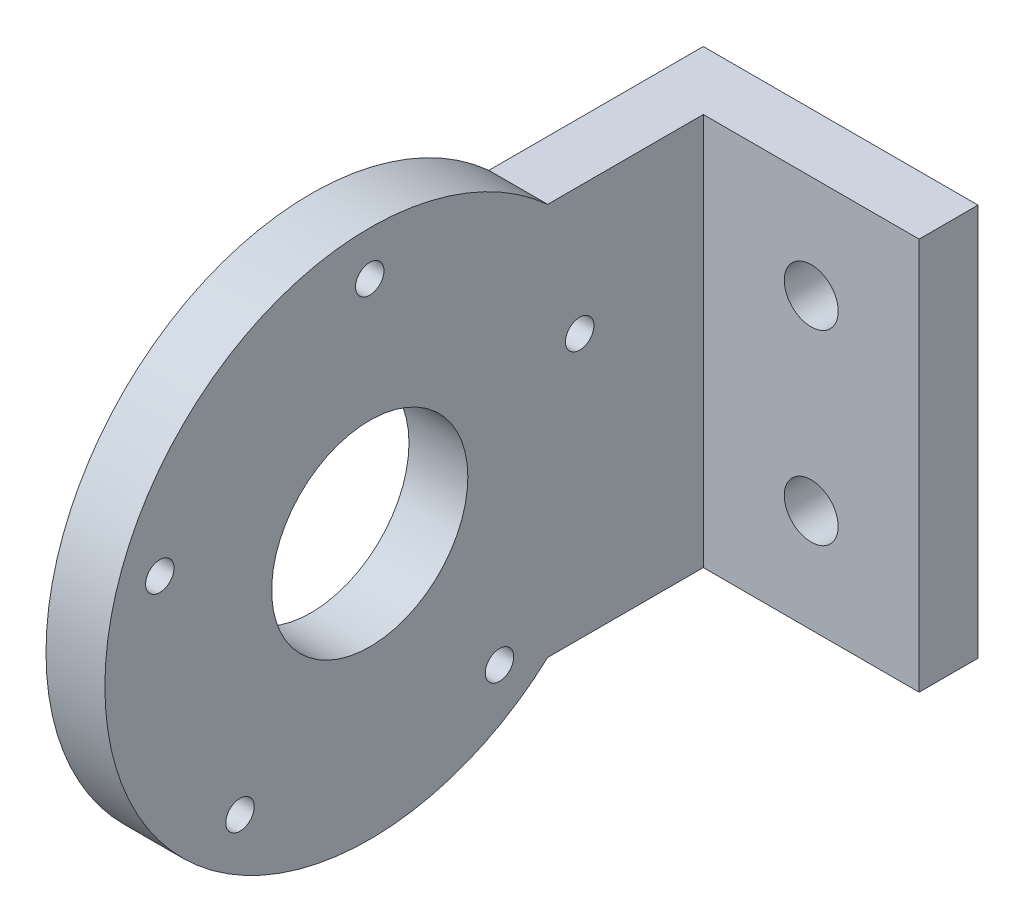
ISO-10303-21;
HEADER;
FILE_DESCRIPTION(('STEP AP214'),'2;1');
FILE_NAME('part.step','',(''),(''),'','','');
FILE_SCHEMA(('AUTOMOTIVE_DESIGN { 1 0 10303 214 1 1 1 1 }'));
ENDSEC;
DATA;
#1=APPLICATION_CONTEXT('core data for automotive mechanical design processes');
#2=APPLICATION_PROTOCOL_DEFINITION('international standard','automotive_design',2000,#1);
#3=PRODUCT_CONTEXT('',#1,'mechanical');
#4=PRODUCT('Part','Part','',(#3));
#5=PRODUCT_RELATED_PRODUCT_CATEGORY('part','',(#4));
#6=PRODUCT_DEFINITION_FORMATION('','',#4);
#7=PRODUCT_DEFINITION_CONTEXT('part definition',#1,'design');
#8=PRODUCT_DEFINITION('design','',#6,#7);
#9=PRODUCT_DEFINITION_SHAPE('','',#8);
#10=(LENGTH_UNIT() NAMED_UNIT(*) SI_UNIT(.MILLI.,.METRE.));
#11=(NAMED_UNIT(*) PLANE_ANGLE_UNIT() SI_UNIT($,.RADIAN.));
#12=(NAMED_UNIT(*) SI_UNIT($,.STERADIAN.) SOLID_ANGLE_UNIT());
#13=UNCERTAINTY_MEASURE_WITH_UNIT(LENGTH_MEASURE(1.E-05),#10,'distance_accuracy_value','');
#14=(GEOMETRIC_REPRESENTATION_CONTEXT(3) GLOBAL_UNCERTAINTY_ASSIGNED_CONTEXT((#13)) GLOBAL_UNIT_ASSIGNED_CONTEXT((#10,
#11,#12)) REPRESENTATION_CONTEXT('',''));
#15=CARTESIAN_POINT('',(0.,0.,0.));
#16=DIRECTION('',(0.,0.,1.));
#17=DIRECTION('',(1.,0.,0.));
#18=AXIS2_PLACEMENT_3D('',#15,#16,#17);
#19=CARTESIAN_POINT('',(227.,300.,300.));
#20=DIRECTION('',(-1.,0.,0.));
#21=DIRECTION('',(0.,0.,1.));
#22=AXIS2_PLACEMENT_3D('',#19,#20,#21);
#23=CYLINDRICAL_SURFACE('',#22,27.);
#24=DIRECTION('',(-1.,0.,0.));
#25=VECTOR('',#24,1.);
#26=CARTESIAN_POINT('',(227.,320.,281.861642852783));
#27=LINE('',#26,#25);
#28=CARTESIAN_POINT('',(221.,320.,281.861642852783));
#29=VERTEX_POINT('',#28);
#30=CARTESIAN_POINT('',(227.,320.,281.861642852783));
#31=VERTEX_POINT('',#30);
#32=EDGE_CURVE('E176',#29,#31,#27,.F.);
#33=ORIENTED_EDGE('',*,*,#32,.F.);
#34=CARTESIAN_POINT('',(221.,300.,300.));
#35=DIRECTION('',(1.,0.,0.));
#36=DIRECTION('',(0.,0.,-1.));
#37=AXIS2_PLACEMENT_3D('',#34,#35,#36);
#38=CIRCLE('',#37,27.);
#39=CARTESIAN_POINT('',(221.,280.,281.861642852783));
#40=VERTEX_POINT('',#39);
#41=EDGE_CURVE('E42',#29,#40,#38,.T.);
#42=ORIENTED_EDGE('',*,*,#41,.T.);
#43=DIRECTION('',(-1.,0.,0.));
#44=VECTOR('',#43,1.);
#45=CARTESIAN_POINT('',(227.,280.,281.861642852783));
#46=LINE('',#45,#44);
#47=CARTESIAN_POINT('',(227.,280.,281.861642852783));
#48=VERTEX_POINT('',#47);
#49=EDGE_CURVE('E60',#48,#40,#46,.T.);
#50=ORIENTED_EDGE('',*,*,#49,.F.);
#51=CARTESIAN_POINT('',(227.,300.,300.));
#52=DIRECTION('',(1.,0.,0.));
#53=DIRECTION('',(0.,0.,-1.));
#54=AXIS2_PLACEMENT_3D('',#51,#52,#53);
#55=CIRCLE('',#54,27.);
#56=EDGE_CURVE('E11',#31,#48,#55,.T.);
#57=ORIENTED_EDGE('',*,*,#56,.F.);
#58=EDGE_LOOP('',(#33,#42,#50,#57));
#59=FACE_BOUND('',#58,.T.);
#60=ADVANCED_FACE('F39',(#59),#23,.T.);
#61=CARTESIAN_POINT('',(227.,300.,300.));
#62=DIRECTION('',(1.,0.,0.));
#63=DIRECTION('',(0.,0.,-1.));
#64=AXIS2_PLACEMENT_3D('',#61,#62,#63);
#65=PLANE('',#64);
#66=DIRECTION('',(0.,-1.,0.));
#67=VECTOR('',#66,1.);
#68=CARTESIAN_POINT('',(227.,300.,266.));
#69=LINE('',#68,#67);
#70=CARTESIAN_POINT('',(227.,320.,266.));
#71=VERTEX_POINT('',#70);
#72=CARTESIAN_POINT('',(227.,280.,266.));
#73=VERTEX_POINT('',#72);
#74=EDGE_CURVE('E99',#71,#73,#69,.T.);
#75=ORIENTED_EDGE('',*,*,#74,.F.);
#76=DIRECTION('',(0.,0.,1.));
#77=VECTOR('',#76,1.);
#78=CARTESIAN_POINT('',(227.,320.,285.));
#79=LINE('',#78,#77);
#80=EDGE_CURVE('E162',#71,#31,#79,.T.);
#81=ORIENTED_EDGE('',*,*,#80,.T.);
#82=ORIENTED_EDGE('',*,*,#56,.T.);
#83=DIRECTION('',(0.,0.,-1.));
#84=VECTOR('',#83,1.);
#85=CARTESIAN_POINT('',(227.,280.,260.));
#86=LINE('',#85,#84);
#87=EDGE_CURVE('E52',#48,#73,#86,.T.);
#88=ORIENTED_EDGE('',*,*,#87,.T.);
#89=EDGE_LOOP('',(#75,#81,#82,#88));
#90=FACE_BOUND('',#89,.T.);
#91=CARTESIAN_POINT('',(227.,306.952882373436,321.398771616641));
#92=DIRECTION('',(1.,0.,0.));
#93=DIRECTION('',(0.,0.,-1.));
#94=AXIS2_PLACEMENT_3D('',#91,#92,#93);
#95=CIRCLE('',#94,1.45000000000001);
#96=CARTESIAN_POINT('',(227.,306.952882373436,319.948771616641));
#97=VERTEX_POINT('',#96);
#98=EDGE_CURVE('E125',#97,#97,#95,.T.);
#99=ORIENTED_EDGE('',*,*,#98,.F.);
#100=EDGE_LOOP('',(#99));
#101=FACE_BOUND('',#100,.T.);
#102=CARTESIAN_POINT('',(227.,281.797117626564,313.225168176581));
#103=DIRECTION('',(1.,0.,0.));
#104=DIRECTION('',(0.,0.,-1.));
#105=AXIS2_PLACEMENT_3D('',#102,#103,#104);
#106=CIRCLE('',#105,1.45000000000001);
#107=CARTESIAN_POINT('',(227.,281.797117626564,311.775168176581));
#108=VERTEX_POINT('',#107);
#109=EDGE_CURVE('E148',#108,#108,#106,.T.);
#110=ORIENTED_EDGE('',*,*,#109,.F.);
#111=EDGE_LOOP('',(#110));
#112=FACE_BOUND('',#111,.T.);
#113=CARTESIAN_POINT('',(227.,281.797117626564,286.774831823419));
#114=DIRECTION('',(1.,0.,0.));
#115=DIRECTION('',(0.,0.,-1.));
#116=AXIS2_PLACEMENT_3D('',#113,#114,#115);
#117=CIRCLE('',#116,1.45000000000001);
#118=CARTESIAN_POINT('',(227.,281.797117626564,285.324831823419));
#119=VERTEX_POINT('',#118);
#120=EDGE_CURVE('E142',#119,#119,#117,.T.);
#121=ORIENTED_EDGE('',*,*,#120,.F.);
#122=EDGE_LOOP('',(#121));
#123=FACE_BOUND('',#122,.T.);
#124=CARTESIAN_POINT('',(227.,306.952882373436,278.601228383359));
#125=DIRECTION('',(1.,0.,0.));
#126=DIRECTION('',(0.,0.,-1.));
#127=AXIS2_PLACEMENT_3D('',#124,#125,#126);
#128=CIRCLE('',#127,1.45000000000001);
#129=CARTESIAN_POINT('',(227.,306.952882373436,277.151228383359));
#130=VERTEX_POINT('',#129);
#131=EDGE_CURVE('E136',#130,#130,#128,.T.);
#132=ORIENTED_EDGE('',*,*,#131,.F.);
#133=EDGE_LOOP('',(#132));
#134=FACE_BOUND('',#133,.T.);
#135=CARTESIAN_POINT('',(227.,322.5,300.));
#136=DIRECTION('',(1.,0.,0.));
#137=DIRECTION('',(0.,0.,-1.));
#138=AXIS2_PLACEMENT_3D('',#135,#136,#137);
#139=CIRCLE('',#138,1.45000000000001);
#140=CARTESIAN_POINT('',(227.,322.5,298.55));
#141=VERTEX_POINT('',#140);
#142=EDGE_CURVE('E130',#141,#141,#139,.T.);
#143=ORIENTED_EDGE('',*,*,#142,.F.);
#144=EDGE_LOOP('',(#143));
#145=FACE_BOUND('',#144,.T.);
#146=CARTESIAN_POINT('',(227.,300.,300.));
#147=DIRECTION('',(1.,0.,0.));
#148=DIRECTION('',(0.,0.,-1.));
#149=AXIS2_PLACEMENT_3D('',#146,#147,#148);
#150=CIRCLE('',#149,10.);
#151=CARTESIAN_POINT('',(227.,300.,290.));
#152=VERTEX_POINT('',#151);
#153=EDGE_CURVE('E156',#152,#152,#150,.T.);
#154=ORIENTED_EDGE('',*,*,#153,.F.);
#155=EDGE_LOOP('',(#154));
#156=FACE_BOUND('',#155,.T.);
#157=ADVANCED_FACE('F189',(#90,#101,#112,#123,#134,#145,#156),#65,.T.);
#158=CARTESIAN_POINT('',(221.,300.,300.));
#159=DIRECTION('',(1.,0.,0.));
#160=DIRECTION('',(0.,0.,-1.));
#161=AXIS2_PLACEMENT_3D('',#158,#159,#160);
#162=PLANE('',#161);
#163=CARTESIAN_POINT('',(221.,306.952882373436,321.398771616641));
#164=DIRECTION('',(1.,0.,0.));
#165=DIRECTION('',(0.,0.,-1.));
#166=AXIS2_PLACEMENT_3D('',#163,#164,#165);
#167=CIRCLE('',#166,1.45000000000001);
#168=CARTESIAN_POINT('',(221.,306.952882373436,319.948771616641));
#169=VERTEX_POINT('',#168);
#170=EDGE_CURVE('E151',#169,#169,#167,.T.);
#171=ORIENTED_EDGE('',*,*,#170,.T.);
#172=EDGE_LOOP('',(#171));
#173=FACE_BOUND('',#172,.T.);
#174=CARTESIAN_POINT('',(221.,281.797117626564,313.225168176581));
#175=DIRECTION('',(1.,0.,0.));
#176=DIRECTION('',(0.,0.,-1.));
#177=AXIS2_PLACEMENT_3D('',#174,#175,#176);
#178=CIRCLE('',#177,1.45000000000001);
#179=CARTESIAN_POINT('',(221.,281.797117626564,311.775168176581));
#180=VERTEX_POINT('',#179);
#181=EDGE_CURVE('E145',#180,#180,#178,.T.);
#182=ORIENTED_EDGE('',*,*,#181,.T.);
#183=EDGE_LOOP('',(#182));
#184=FACE_BOUND('',#183,.T.);
#185=CARTESIAN_POINT('',(221.,281.797117626564,286.774831823419));
#186=DIRECTION('',(1.,0.,0.));
#187=DIRECTION('',(0.,0.,-1.));
#188=AXIS2_PLACEMENT_3D('',#185,#186,#187);
#189=CIRCLE('',#188,1.45000000000001);
#190=CARTESIAN_POINT('',(221.,281.797117626564,285.324831823419));
#191=VERTEX_POINT('',#190);
#192=EDGE_CURVE('E139',#191,#191,#189,.T.);
#193=ORIENTED_EDGE('',*,*,#192,.T.);
#194=EDGE_LOOP('',(#193));
#195=FACE_BOUND('',#194,.T.);
#196=CARTESIAN_POINT('',(221.,306.952882373436,278.601228383359));
#197=DIRECTION('',(1.,0.,0.));
#198=DIRECTION('',(0.,0.,-1.));
#199=AXIS2_PLACEMENT_3D('',#196,#197,#198);
#200=CIRCLE('',#199,1.45000000000001);
#201=CARTESIAN_POINT('',(221.,306.952882373436,277.151228383359));
#202=VERTEX_POINT('',#201);
#203=EDGE_CURVE('E133',#202,#202,#200,.T.);
#204=ORIENTED_EDGE('',*,*,#203,.T.);
#205=EDGE_LOOP('',(#204));
#206=FACE_BOUND('',#205,.T.);
#207=CARTESIAN_POINT('',(221.,322.5,300.));
#208=DIRECTION('',(1.,0.,0.));
#209=DIRECTION('',(0.,0.,-1.));
#210=AXIS2_PLACEMENT_3D('',#207,#208,#209);
#211=CIRCLE('',#210,1.45000000000001);
#212=CARTESIAN_POINT('',(221.,322.5,298.55));
#213=VERTEX_POINT('',#212);
#214=EDGE_CURVE('E126',#213,#213,#211,.T.);
#215=ORIENTED_EDGE('',*,*,#214,.T.);
#216=EDGE_LOOP('',(#215));
#217=FACE_BOUND('',#216,.T.);
#218=CARTESIAN_POINT('',(221.,300.,300.));
#219=DIRECTION('',(1.,0.,0.));
#220=DIRECTION('',(0.,0.,-1.));
#221=AXIS2_PLACEMENT_3D('',#218,#219,#220);
#222=CIRCLE('',#221,10.);
#223=CARTESIAN_POINT('',(221.,300.,290.));
#224=VERTEX_POINT('',#223);
#225=EDGE_CURVE('E129',#224,#224,#222,.T.);
#226=ORIENTED_EDGE('',*,*,#225,.T.);
#227=EDGE_LOOP('',(#226));
#228=FACE_BOUND('',#227,.T.);
#229=ORIENTED_EDGE('',*,*,#41,.F.);
#230=DIRECTION('',(0.,0.,1.));
#231=VECTOR('',#230,1.);
#232=CARTESIAN_POINT('',(221.,320.,285.));
#233=LINE('',#232,#231);
#234=CARTESIAN_POINT('',(221.,320.,260.));
#235=VERTEX_POINT('',#234);
#236=EDGE_CURVE('E168',#235,#29,#233,.T.);
#237=ORIENTED_EDGE('',*,*,#236,.F.);
#238=DIRECTION('',(0.,1.,0.));
#239=VECTOR('',#238,1.);
#240=CARTESIAN_POINT('',(221.,320.,260.));
#241=LINE('',#240,#239);
#242=CARTESIAN_POINT('',(221.,280.,260.));
#243=VERTEX_POINT('',#242);
#244=EDGE_CURVE('E159',#243,#235,#241,.T.);
#245=ORIENTED_EDGE('',*,*,#244,.F.);
#246=DIRECTION('',(0.,0.,-1.));
#247=VECTOR('',#246,1.);
#248=CARTESIAN_POINT('',(221.,280.,260.));
#249=LINE('',#248,#247);
#250=EDGE_CURVE('E164',#40,#243,#249,.T.);
#251=ORIENTED_EDGE('',*,*,#250,.F.);
#252=EDGE_LOOP('',(#229,#237,#245,#251));
#253=FACE_BOUND('',#252,.T.);
#254=ADVANCED_FACE('F184',(#173,#184,#195,#206,#217,#228,#253),#162,.F.);
#255=CARTESIAN_POINT('',(227.,320.,285.));
#256=DIRECTION('',(0.,-1.,0.));
#257=DIRECTION('',(0.,0.,-1.));
#258=AXIS2_PLACEMENT_3D('',#255,#256,#257);
#259=PLANE('',#258);
#260=ORIENTED_EDGE('',*,*,#80,.F.);
#261=DIRECTION('',(-1.,0.,0.));
#262=VECTOR('',#261,1.);
#263=CARTESIAN_POINT('',(249.,320.,266.));
#264=LINE('',#263,#262);
#265=CARTESIAN_POINT('',(249.,320.,266.));
#266=VERTEX_POINT('',#265);
#267=EDGE_CURVE('E116',#266,#71,#264,.T.);
#268=ORIENTED_EDGE('',*,*,#267,.F.);
#269=DIRECTION('',(0.,0.,-1.));
#270=VECTOR('',#269,1.);
#271=CARTESIAN_POINT('',(249.,320.,266.));
#272=LINE('',#271,#270);
#273=CARTESIAN_POINT('',(249.,320.,260.));
#274=VERTEX_POINT('',#273);
#275=EDGE_CURVE('E111',#266,#274,#272,.T.);
#276=ORIENTED_EDGE('',*,*,#275,.T.);
#277=DIRECTION('',(-1.,0.,0.));
#278=VECTOR('',#277,1.);
#279=CARTESIAN_POINT('',(227.,320.,260.));
#280=LINE('',#279,#278);
#281=EDGE_CURVE('E173',#274,#235,#280,.T.);
#282=ORIENTED_EDGE('',*,*,#281,.T.);
#283=ORIENTED_EDGE('',*,*,#236,.T.);
#284=ORIENTED_EDGE('',*,*,#32,.T.);
#285=EDGE_LOOP('',(#260,#268,#276,#282,#283,#284));
#286=FACE_BOUND('',#285,.T.);
#287=ADVANCED_FACE('F188',(#286),#259,.F.);
#288=CARTESIAN_POINT('',(227.,280.,260.));
#289=DIRECTION('',(0.,1.,0.));
#290=DIRECTION('',(0.,0.,1.));
#291=AXIS2_PLACEMENT_3D('',#288,#289,#290);
#292=PLANE('',#291);
#293=DIRECTION('',(-1.,0.,0.));
#294=VECTOR('',#293,1.);
#295=CARTESIAN_POINT('',(227.,280.,260.));
#296=LINE('',#295,#294);
#297=CARTESIAN_POINT('',(249.,280.,260.));
#298=VERTEX_POINT('',#297);
#299=EDGE_CURVE('E107',#298,#243,#296,.T.);
#300=ORIENTED_EDGE('',*,*,#299,.F.);
#301=DIRECTION('',(0.,0.,-1.));
#302=VECTOR('',#301,1.);
#303=CARTESIAN_POINT('',(249.,280.,266.));
#304=LINE('',#303,#302);
#305=CARTESIAN_POINT('',(249.,280.,266.));
#306=VERTEX_POINT('',#305);
#307=EDGE_CURVE('E104',#306,#298,#304,.T.);
#308=ORIENTED_EDGE('',*,*,#307,.F.);
#309=DIRECTION('',(1.,0.,0.));
#310=VECTOR('',#309,1.);
#311=CARTESIAN_POINT('',(226.99,280.,266.));
#312=LINE('',#311,#310);
#313=EDGE_CURVE('E91',#73,#306,#312,.T.);
#314=ORIENTED_EDGE('',*,*,#313,.F.);
#315=ORIENTED_EDGE('',*,*,#87,.F.);
#316=ORIENTED_EDGE('',*,*,#49,.T.);
#317=ORIENTED_EDGE('',*,*,#250,.T.);
#318=EDGE_LOOP('',(#300,#308,#314,#315,#316,#317));
#319=FACE_BOUND('',#318,.T.);
#320=ADVANCED_FACE('F105',(#319),#292,.F.);
#321=CARTESIAN_POINT('',(227.,320.,260.));
#322=DIRECTION('',(0.,0.,1.));
#323=DIRECTION('',(1.,0.,0.));
#324=AXIS2_PLACEMENT_3D('',#321,#322,#323);
#325=PLANE('',#324);
#326=ORIENTED_EDGE('',*,*,#299,.T.);
#327=ORIENTED_EDGE('',*,*,#244,.T.);
#328=ORIENTED_EDGE('',*,*,#281,.F.);
#329=DIRECTION('',(0.,1.,0.));
#330=VECTOR('',#329,1.);
#331=CARTESIAN_POINT('',(249.,280.,260.));
#332=LINE('',#331,#330);
#333=EDGE_CURVE('E101',#298,#274,#332,.T.);
#334=ORIENTED_EDGE('',*,*,#333,.F.);
#335=EDGE_LOOP('',(#326,#327,#328,#334));
#336=FACE_BOUND('',#335,.T.);
#337=CARTESIAN_POINT('',(238.,290.5,260.));
#338=DIRECTION('',(0.,0.,1.));
#339=DIRECTION('',(1.,0.,0.));
#340=AXIS2_PLACEMENT_3D('',#337,#338,#339);
#341=CIRCLE('',#340,2.75);
#342=CARTESIAN_POINT('',(240.75,290.5,260.));
#343=VERTEX_POINT('',#342);
#344=EDGE_CURVE('E374',#343,#343,#341,.T.);
#345=ORIENTED_EDGE('',*,*,#344,.T.);
#346=EDGE_LOOP('',(#345));
#347=FACE_BOUND('',#346,.T.);
#348=CARTESIAN_POINT('',(238.,309.5,260.));
#349=DIRECTION('',(0.,0.,1.));
#350=DIRECTION('',(1.,0.,0.));
#351=AXIS2_PLACEMENT_3D('',#348,#349,#350);
#352=CIRCLE('',#351,2.75);
#353=CARTESIAN_POINT('',(240.75,309.5,260.));
#354=VERTEX_POINT('',#353);
#355=EDGE_CURVE('E371',#354,#354,#352,.T.);
#356=ORIENTED_EDGE('',*,*,#355,.T.);
#357=EDGE_LOOP('',(#356));
#358=FACE_BOUND('',#357,.T.);
#359=ADVANCED_FACE('F186',(#336,#347,#358),#325,.F.);
#360=CARTESIAN_POINT('',(227.,300.,300.));
#361=DIRECTION('',(-1.,0.,0.));
#362=DIRECTION('',(0.,0.,1.));
#363=AXIS2_PLACEMENT_3D('',#360,#361,#362);
#364=CYLINDRICAL_SURFACE('',#363,10.);
#365=ORIENTED_EDGE('',*,*,#153,.T.);
#366=EDGE_LOOP('',(#365));
#367=FACE_BOUND('',#366,.T.);
#368=ORIENTED_EDGE('',*,*,#225,.F.);
#369=EDGE_LOOP('',(#368));
#370=FACE_BOUND('',#369,.T.);
#371=ADVANCED_FACE('F205',(#367,#370),#364,.F.);
#372=CARTESIAN_POINT('',(227.,322.5,300.));
#373=DIRECTION('',(-1.,0.,0.));
#374=DIRECTION('',(0.,0.,1.));
#375=AXIS2_PLACEMENT_3D('',#372,#373,#374);
#376=CYLINDRICAL_SURFACE('',#375,1.45000000000001);
#377=ORIENTED_EDGE('',*,*,#142,.T.);
#378=EDGE_LOOP('',(#377));
#379=FACE_BOUND('',#378,.T.);
#380=ORIENTED_EDGE('',*,*,#214,.F.);
#381=EDGE_LOOP('',(#380));
#382=FACE_BOUND('',#381,.T.);
#383=ADVANCED_FACE('F208',(#379,#382),#376,.F.);
#384=CARTESIAN_POINT('',(227.,306.952882373436,278.601228383359));
#385=DIRECTION('',(-1.,0.,0.));
#386=DIRECTION('',(0.,0.,1.));
#387=AXIS2_PLACEMENT_3D('',#384,#385,#386);
#388=CYLINDRICAL_SURFACE('',#387,1.45000000000001);
#389=ORIENTED_EDGE('',*,*,#131,.T.);
#390=EDGE_LOOP('',(#389));
#391=FACE_BOUND('',#390,.T.);
#392=ORIENTED_EDGE('',*,*,#203,.F.);
#393=EDGE_LOOP('',(#392));
#394=FACE_BOUND('',#393,.T.);
#395=ADVANCED_FACE('F263',(#391,#394),#388,.F.);
#396=CARTESIAN_POINT('',(227.,281.797117626564,286.774831823419));
#397=DIRECTION('',(-1.,0.,0.));
#398=DIRECTION('',(0.,0.,1.));
#399=AXIS2_PLACEMENT_3D('',#396,#397,#398);
#400=CYLINDRICAL_SURFACE('',#399,1.45000000000001);
#401=ORIENTED_EDGE('',*,*,#120,.T.);
#402=EDGE_LOOP('',(#401));
#403=FACE_BOUND('',#402,.T.);
#404=ORIENTED_EDGE('',*,*,#192,.F.);
#405=EDGE_LOOP('',(#404));
#406=FACE_BOUND('',#405,.T.);
#407=ADVANCED_FACE('F272',(#403,#406),#400,.F.);
#408=CARTESIAN_POINT('',(227.,281.797117626564,313.225168176581));
#409=DIRECTION('',(-1.,0.,0.));
#410=DIRECTION('',(0.,0.,1.));
#411=AXIS2_PLACEMENT_3D('',#408,#409,#410);
#412=CYLINDRICAL_SURFACE('',#411,1.45000000000001);
#413=ORIENTED_EDGE('',*,*,#109,.T.);
#414=EDGE_LOOP('',(#413));
#415=FACE_BOUND('',#414,.T.);
#416=ORIENTED_EDGE('',*,*,#181,.F.);
#417=EDGE_LOOP('',(#416));
#418=FACE_BOUND('',#417,.T.);
#419=ADVANCED_FACE('F281',(#415,#418),#412,.F.);
#420=CARTESIAN_POINT('',(227.,306.952882373436,321.398771616641));
#421=DIRECTION('',(-1.,0.,0.));
#422=DIRECTION('',(0.,0.,1.));
#423=AXIS2_PLACEMENT_3D('',#420,#421,#422);
#424=CYLINDRICAL_SURFACE('',#423,1.45000000000001);
#425=ORIENTED_EDGE('',*,*,#98,.T.);
#426=EDGE_LOOP('',(#425));
#427=FACE_BOUND('',#426,.T.);
#428=ORIENTED_EDGE('',*,*,#170,.F.);
#429=EDGE_LOOP('',(#428));
#430=FACE_BOUND('',#429,.T.);
#431=ADVANCED_FACE('F290',(#427,#430),#424,.F.);
#432=CARTESIAN_POINT('',(0.,0.,266.));
#433=DIRECTION('',(0.,0.,1.));
#434=DIRECTION('',(1.,0.,0.));
#435=AXIS2_PLACEMENT_3D('',#432,#433,#434);
#436=PLANE('',#435);
#437=CARTESIAN_POINT('',(238.,290.5,266.));
#438=DIRECTION('',(0.,0.,1.));
#439=DIRECTION('',(1.,0.,0.));
#440=AXIS2_PLACEMENT_3D('',#437,#438,#439);
#441=CIRCLE('',#440,2.75);
#442=CARTESIAN_POINT('',(240.75,290.5,266.));
#443=VERTEX_POINT('',#442);
#444=EDGE_CURVE('E122',#443,#443,#441,.T.);
#445=ORIENTED_EDGE('',*,*,#444,.F.);
#446=EDGE_LOOP('',(#445));
#447=FACE_BOUND('',#446,.T.);
#448=ORIENTED_EDGE('',*,*,#267,.T.);
#449=ORIENTED_EDGE('',*,*,#74,.T.);
#450=ORIENTED_EDGE('',*,*,#313,.T.);
#451=DIRECTION('',(0.,1.,0.));
#452=VECTOR('',#451,1.);
#453=CARTESIAN_POINT('',(249.,280.,266.));
#454=LINE('',#453,#452);
#455=EDGE_CURVE('E97',#306,#266,#454,.T.);
#456=ORIENTED_EDGE('',*,*,#455,.T.);
#457=EDGE_LOOP('',(#448,#449,#450,#456));
#458=FACE_BOUND('',#457,.T.);
#459=CARTESIAN_POINT('',(238.,309.5,266.));
#460=DIRECTION('',(0.,0.,1.));
#461=DIRECTION('',(1.,0.,0.));
#462=AXIS2_PLACEMENT_3D('',#459,#460,#461);
#463=CIRCLE('',#462,2.75);
#464=CARTESIAN_POINT('',(240.75,309.5,266.));
#465=VERTEX_POINT('',#464);
#466=EDGE_CURVE('E368',#465,#465,#463,.T.);
#467=ORIENTED_EDGE('',*,*,#466,.F.);
#468=EDGE_LOOP('',(#467));
#469=FACE_BOUND('',#468,.T.);
#470=ADVANCED_FACE('F94',(#447,#458,#469),#436,.T.);
#471=CARTESIAN_POINT('',(249.,280.,266.));
#472=DIRECTION('',(-1.,0.,0.));
#473=DIRECTION('',(0.,0.,1.));
#474=AXIS2_PLACEMENT_3D('',#471,#472,#473);
#475=PLANE('',#474);
#476=ORIENTED_EDGE('',*,*,#333,.T.);
#477=ORIENTED_EDGE('',*,*,#275,.F.);
#478=ORIENTED_EDGE('',*,*,#455,.F.);
#479=ORIENTED_EDGE('',*,*,#307,.T.);
#480=EDGE_LOOP('',(#476,#477,#478,#479));
#481=FACE_BOUND('',#480,.T.);
#482=ADVANCED_FACE('F113',(#481),#475,.F.);
#483=CARTESIAN_POINT('',(238.,290.5,266.));
#484=DIRECTION('',(0.,0.,-1.));
#485=DIRECTION('',(-1.,0.,0.));
#486=AXIS2_PLACEMENT_3D('',#483,#484,#485);
#487=CYLINDRICAL_SURFACE('',#486,2.75);
#488=ORIENTED_EDGE('',*,*,#444,.T.);
#489=EDGE_LOOP('',(#488));
#490=FACE_BOUND('',#489,.T.);
#491=ORIENTED_EDGE('',*,*,#344,.F.);
#492=EDGE_LOOP('',(#491));
#493=FACE_BOUND('',#492,.T.);
#494=ADVANCED_FACE('F315',(#490,#493),#487,.F.);
#495=CARTESIAN_POINT('',(238.,309.5,266.));
#496=DIRECTION('',(0.,0.,-1.));
#497=DIRECTION('',(-1.,0.,0.));
#498=AXIS2_PLACEMENT_3D('',#495,#496,#497);
#499=CYLINDRICAL_SURFACE('',#498,2.75);
#500=ORIENTED_EDGE('',*,*,#466,.T.);
#501=EDGE_LOOP('',(#500));
#502=FACE_BOUND('',#501,.T.);
#503=ORIENTED_EDGE('',*,*,#355,.F.);
#504=EDGE_LOOP('',(#503));
#505=FACE_BOUND('',#504,.T.);
#506=ADVANCED_FACE('F323',(#502,#505),#499,.F.);
#507=CLOSED_SHELL('',(#60,#157,#254,#287,#320,#359,#371,#383,#395,#407,#419,#431,#470,#482,#494,#506));
#508=MANIFOLD_SOLID_BREP('B2',#507);
#509=ADVANCED_BREP_SHAPE_REPRESENTATION('',(#18,#508),#14);
#510=SHAPE_DEFINITION_REPRESENTATION(#9,#509);
ENDSEC;
END-ISO-10303-21;
